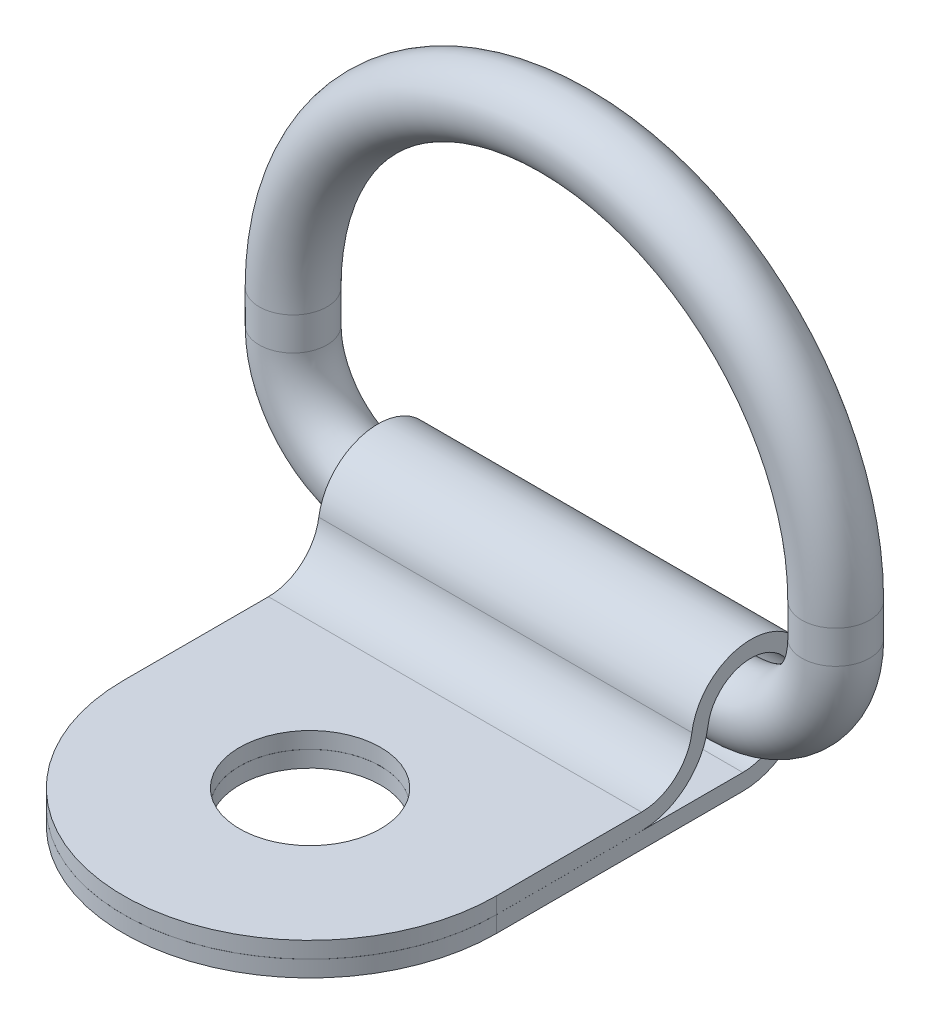
ISO-10303-21;
HEADER;
FILE_DESCRIPTION(('STEP AP214'),'2;1');
FILE_NAME('part.step','',(''),(''),'','','');
FILE_SCHEMA(('AUTOMOTIVE_DESIGN { 1 0 10303 214 1 1 1 1 }'));
ENDSEC;
DATA;
#1=APPLICATION_CONTEXT('core data for automotive mechanical design processes');
#2=APPLICATION_PROTOCOL_DEFINITION('international standard','automotive_design',2000,#1);
#3=PRODUCT_CONTEXT('',#1,'mechanical');
#4=PRODUCT('Part','Part','',(#3));
#5=PRODUCT_RELATED_PRODUCT_CATEGORY('part','',(#4));
#6=PRODUCT_DEFINITION_FORMATION('','',#4);
#7=PRODUCT_DEFINITION_CONTEXT('part definition',#1,'design');
#8=PRODUCT_DEFINITION('design','',#6,#7);
#9=PRODUCT_DEFINITION_SHAPE('','',#8);
#10=(LENGTH_UNIT() NAMED_UNIT(*) SI_UNIT(.MILLI.,.METRE.));
#11=(NAMED_UNIT(*) PLANE_ANGLE_UNIT() SI_UNIT($,.RADIAN.));
#12=(NAMED_UNIT(*) SI_UNIT($,.STERADIAN.) SOLID_ANGLE_UNIT());
#13=UNCERTAINTY_MEASURE_WITH_UNIT(LENGTH_MEASURE(1.E-05),#10,'distance_accuracy_value','');
#14=(GEOMETRIC_REPRESENTATION_CONTEXT(3) GLOBAL_UNCERTAINTY_ASSIGNED_CONTEXT((#13)) GLOBAL_UNIT_ASSIGNED_CONTEXT((#10,
#11,#12)) REPRESENTATION_CONTEXT('',''));
#15=CARTESIAN_POINT('',(0.,0.,0.));
#16=DIRECTION('',(0.,0.,1.));
#17=DIRECTION('',(1.,0.,0.));
#18=AXIS2_PLACEMENT_3D('',#15,#16,#17);
#19=CARTESIAN_POINT('',(8.73125,-3.175,20.6375));
#20=DIRECTION('',(0.,1.,0.));
#21=DIRECTION('',(0.,0.,1.));
#22=AXIS2_PLACEMENT_3D('',#19,#20,#21);
#23=PLANE('',#22);
#24=CARTESIAN_POINT('',(0.,-3.175,11.90625));
#25=DIRECTION('',(0.,-1.,0.));
#26=DIRECTION('',(0.,0.,-1.));
#27=AXIS2_PLACEMENT_3D('',#24,#25,#26);
#28=CIRCLE('',#27,3.302);
#29=CARTESIAN_POINT('',(0.,-3.175,8.60425));
#30=VERTEX_POINT('',#29);
#31=EDGE_CURVE('E264',#30,#30,#28,.T.);
#32=ORIENTED_EDGE('',*,*,#31,.F.);
#33=EDGE_LOOP('',(#32));
#34=FACE_BOUND('',#33,.T.);
#35=CARTESIAN_POINT('',(0.,-3.175,11.90625));
#36=DIRECTION('',(0.,1.,0.));
#37=DIRECTION('',(0.,0.,-1.));
#38=AXIS2_PLACEMENT_3D('',#35,#36,#37);
#39=CIRCLE('',#38,8.73125);
#40=CARTESIAN_POINT('',(-8.73125,-3.175,11.90625));
#41=VERTEX_POINT('',#40);
#42=CARTESIAN_POINT('',(8.73125,-3.175,11.90625));
#43=VERTEX_POINT('',#42);
#44=EDGE_CURVE('E125',#41,#43,#39,.T.);
#45=ORIENTED_EDGE('',*,*,#44,.F.);
#46=DIRECTION('',(0.,0.,-1.));
#47=VECTOR('',#46,1.);
#48=CARTESIAN_POINT('',(-8.73125,-3.175,20.6375));
#49=LINE('',#48,#47);
#50=CARTESIAN_POINT('',(-8.73125,-3.175,0.381));
#51=VERTEX_POINT('',#50);
#52=EDGE_CURVE('E173',#41,#51,#49,.T.);
#53=ORIENTED_EDGE('',*,*,#52,.T.);
#54=DIRECTION('',(-1.,0.,0.));
#55=VECTOR('',#54,1.);
#56=CARTESIAN_POINT('',(8.73125,-3.175,0.381));
#57=LINE('',#56,#55);
#58=CARTESIAN_POINT('',(8.73125,-3.175,0.381));
#59=VERTEX_POINT('',#58);
#60=EDGE_CURVE('E144',#59,#51,#57,.T.);
#61=ORIENTED_EDGE('',*,*,#60,.F.);
#62=DIRECTION('',(0.,0.,-1.));
#63=VECTOR('',#62,1.);
#64=CARTESIAN_POINT('',(8.73125,-3.175,20.6375));
#65=LINE('',#64,#63);
#66=EDGE_CURVE('E137',#43,#59,#65,.T.);
#67=ORIENTED_EDGE('',*,*,#66,.F.);
#68=EDGE_LOOP('',(#45,#53,#61,#67));
#69=FACE_BOUND('',#68,.T.);
#70=ADVANCED_FACE('F39',(#34,#69),#23,.F.);
#71=CARTESIAN_POINT('',(8.73125,0.,0.381));
#72=DIRECTION('',(-1.,0.,0.));
#73=DIRECTION('',(0.,0.,1.));
#74=AXIS2_PLACEMENT_3D('',#71,#72,#73);
#75=CYLINDRICAL_SURFACE('',#74,3.175);
#76=CARTESIAN_POINT('',(-8.73125,0.,0.381));
#77=DIRECTION('',(1.,0.,0.));
#78=DIRECTION('',(0.,0.,-1.));
#79=AXIS2_PLACEMENT_3D('',#76,#77,#78);
#80=CIRCLE('',#79,3.175);
#81=CARTESIAN_POINT('',(-8.73125,0.,-2.794));
#82=VERTEX_POINT('',#81);
#83=EDGE_CURVE('E175',#51,#82,#80,.T.);
#84=ORIENTED_EDGE('',*,*,#83,.T.);
#85=DIRECTION('',(-1.,0.,0.));
#86=VECTOR('',#85,1.);
#87=CARTESIAN_POINT('',(8.73125,0.,-2.794));
#88=LINE('',#87,#86);
#89=CARTESIAN_POINT('',(8.73125,0.,-2.794));
#90=VERTEX_POINT('',#89);
#91=EDGE_CURVE('E208',#90,#82,#88,.T.);
#92=ORIENTED_EDGE('',*,*,#91,.F.);
#93=CARTESIAN_POINT('',(8.73125,0.,0.381));
#94=DIRECTION('',(1.,0.,0.));
#95=DIRECTION('',(0.,0.,-1.));
#96=AXIS2_PLACEMENT_3D('',#93,#94,#95);
#97=CIRCLE('',#96,3.175);
#98=EDGE_CURVE('E146',#59,#90,#97,.T.);
#99=ORIENTED_EDGE('',*,*,#98,.F.);
#100=ORIENTED_EDGE('',*,*,#60,.T.);
#101=EDGE_LOOP('',(#84,#92,#99,#100));
#102=FACE_BOUND('',#101,.T.);
#103=ADVANCED_FACE('F233',(#102),#75,.T.);
#104=CARTESIAN_POINT('',(8.73125,0.,0.));
#105=DIRECTION('',(-1.,0.,0.));
#106=DIRECTION('',(0.,0.,1.));
#107=AXIS2_PLACEMENT_3D('',#104,#105,#106);
#108=CYLINDRICAL_SURFACE('',#107,2.794);
#109=CARTESIAN_POINT('',(-8.73125,0.,0.));
#110=DIRECTION('',(1.,0.,0.));
#111=DIRECTION('',(0.,0.,1.));
#112=AXIS2_PLACEMENT_3D('',#109,#110,#111);
#113=CIRCLE('',#112,2.794);
#114=CARTESIAN_POINT('',(-8.73125,0.395616687116565,2.76584949642509));
#115=VERTEX_POINT('',#114);
#116=EDGE_CURVE('E177',#82,#115,#113,.T.);
#117=ORIENTED_EDGE('',*,*,#116,.T.);
#118=DIRECTION('',(-1.,0.,0.));
#119=VECTOR('',#118,1.);
#120=CARTESIAN_POINT('',(8.73125,0.395616687116565,2.76584949642509));
#121=LINE('',#120,#119);
#122=CARTESIAN_POINT('',(8.73125,0.395616687116565,2.76584949642509));
#123=VERTEX_POINT('',#122);
#124=EDGE_CURVE('E205',#123,#115,#121,.T.);
#125=ORIENTED_EDGE('',*,*,#124,.F.);
#126=CARTESIAN_POINT('',(8.73125,0.,0.));
#127=DIRECTION('',(1.,0.,0.));
#128=DIRECTION('',(0.,0.,1.));
#129=AXIS2_PLACEMENT_3D('',#126,#127,#128);
#130=CIRCLE('',#129,2.794);
#131=EDGE_CURVE('E149',#90,#123,#130,.T.);
#132=ORIENTED_EDGE('',*,*,#131,.F.);
#133=ORIENTED_EDGE('',*,*,#91,.T.);
#134=EDGE_LOOP('',(#117,#125,#132,#133));
#135=FACE_BOUND('',#134,.T.);
#136=ADVANCED_FACE('F229',(#135),#108,.T.);
#137=CARTESIAN_POINT('',(8.73125,0.73279,5.1231075899692));
#138=DIRECTION('',(-1.,0.,0.));
#139=DIRECTION('',(0.,0.,1.));
#140=AXIS2_PLACEMENT_3D('',#137,#138,#139);
#141=CYLINDRICAL_SURFACE('',#140,2.38125);
#142=CARTESIAN_POINT('',(-8.73125,0.73279,5.1231075899692));
#143=DIRECTION('',(-1.,0.,0.));
#144=DIRECTION('',(0.,0.,1.));
#145=AXIS2_PLACEMENT_3D('',#142,#143,#144);
#146=CIRCLE('',#145,2.38125);
#147=CARTESIAN_POINT('',(-8.73125,-1.64846,5.1231075899692));
#148=VERTEX_POINT('',#147);
#149=EDGE_CURVE('E179',#115,#148,#146,.T.);
#150=ORIENTED_EDGE('',*,*,#149,.T.);
#151=DIRECTION('',(-1.,0.,0.));
#152=VECTOR('',#151,1.);
#153=CARTESIAN_POINT('',(8.73125,-1.64846,5.1231075899692));
#154=LINE('',#153,#152);
#155=CARTESIAN_POINT('',(8.73125,-1.64846,5.1231075899692));
#156=VERTEX_POINT('',#155);
#157=EDGE_CURVE('E202',#156,#148,#154,.T.);
#158=ORIENTED_EDGE('',*,*,#157,.F.);
#159=CARTESIAN_POINT('',(8.73125,0.73279,5.1231075899692));
#160=DIRECTION('',(-1.,0.,0.));
#161=DIRECTION('',(0.,0.,1.));
#162=AXIS2_PLACEMENT_3D('',#159,#160,#161);
#163=CIRCLE('',#162,2.38125);
#164=EDGE_CURVE('E158',#123,#156,#163,.T.);
#165=ORIENTED_EDGE('',*,*,#164,.F.);
#166=ORIENTED_EDGE('',*,*,#124,.T.);
#167=EDGE_LOOP('',(#150,#158,#165,#166));
#168=FACE_BOUND('',#167,.T.);
#169=ADVANCED_FACE('F224',(#168),#141,.F.);
#170=CARTESIAN_POINT('',(8.73125,-1.64846,20.6375));
#171=DIRECTION('',(0.,-1.,0.));
#172=DIRECTION('',(0.,0.,-1.));
#173=AXIS2_PLACEMENT_3D('',#170,#171,#172);
#174=PLANE('',#173);
#175=CARTESIAN_POINT('',(0.,-1.64846,11.90625));
#176=DIRECTION('',(0.,-1.,0.));
#177=DIRECTION('',(0.,0.,-1.));
#178=AXIS2_PLACEMENT_3D('',#175,#176,#177);
#179=CIRCLE('',#178,3.302);
#180=CARTESIAN_POINT('',(0.,-1.64846,8.60425));
#181=VERTEX_POINT('',#180);
#182=EDGE_CURVE('E132',#181,#181,#179,.T.);
#183=ORIENTED_EDGE('',*,*,#182,.T.);
#184=EDGE_LOOP('',(#183));
#185=FACE_BOUND('',#184,.T.);
#186=DIRECTION('',(0.,0.,1.));
#187=VECTOR('',#186,1.);
#188=CARTESIAN_POINT('',(-8.73125,-1.64846,20.6375));
#189=LINE('',#188,#187);
#190=CARTESIAN_POINT('',(-8.73125,-1.64846,11.90625));
#191=VERTEX_POINT('',#190);
#192=EDGE_CURVE('E181',#148,#191,#189,.T.);
#193=ORIENTED_EDGE('',*,*,#192,.T.);
#194=CARTESIAN_POINT('',(0.,-1.64846,11.90625));
#195=DIRECTION('',(0.,-1.,0.));
#196=DIRECTION('',(0.,0.,-1.));
#197=AXIS2_PLACEMENT_3D('',#194,#195,#196);
#198=CIRCLE('',#197,8.73125);
#199=CARTESIAN_POINT('',(8.73125,-1.64846,11.90625));
#200=VERTEX_POINT('',#199);
#201=EDGE_CURVE('E54',#191,#200,#198,.F.);
#202=ORIENTED_EDGE('',*,*,#201,.T.);
#203=DIRECTION('',(0.,0.,1.));
#204=VECTOR('',#203,1.);
#205=CARTESIAN_POINT('',(8.73125,-1.64846,20.6375));
#206=LINE('',#205,#204);
#207=EDGE_CURVE('E160',#156,#200,#206,.T.);
#208=ORIENTED_EDGE('',*,*,#207,.F.);
#209=ORIENTED_EDGE('',*,*,#157,.T.);
#210=EDGE_LOOP('',(#193,#202,#208,#209));
#211=FACE_BOUND('',#210,.T.);
#212=ADVANCED_FACE('F219',(#185,#211),#174,.F.);
#213=CARTESIAN_POINT('',(8.73125,-2.41046,20.6375));
#214=DIRECTION('',(0.,1.,0.));
#215=DIRECTION('',(0.,0.,1.));
#216=AXIS2_PLACEMENT_3D('',#213,#214,#215);
#217=PLANE('',#216);
#218=CARTESIAN_POINT('',(0.,-2.41046,11.90625));
#219=DIRECTION('',(0.,1.,0.));
#220=DIRECTION('',(0.,0.,1.));
#221=AXIS2_PLACEMENT_3D('',#218,#219,#220);
#222=CIRCLE('',#221,3.302);
#223=CARTESIAN_POINT('',(0.,-2.41046,15.20825));
#224=VERTEX_POINT('',#223);
#225=EDGE_CURVE('E261',#224,#224,#222,.T.);
#226=ORIENTED_EDGE('',*,*,#225,.T.);
#227=EDGE_LOOP('',(#226));
#228=FACE_BOUND('',#227,.T.);
#229=DIRECTION('',(0.,0.,-1.));
#230=VECTOR('',#229,1.);
#231=CARTESIAN_POINT('',(8.73125,-2.41046,20.6375));
#232=LINE('',#231,#230);
#233=CARTESIAN_POINT('',(8.73125,-2.41046,11.90625));
#234=VERTEX_POINT('',#233);
#235=CARTESIAN_POINT('',(8.73125,-2.41046,5.1231075899692));
#236=VERTEX_POINT('',#235);
#237=EDGE_CURVE('E163',#234,#236,#232,.T.);
#238=ORIENTED_EDGE('',*,*,#237,.F.);
#239=CARTESIAN_POINT('',(0.,-2.41046,11.90625));
#240=DIRECTION('',(0.,1.,0.));
#241=DIRECTION('',(0.,0.,1.));
#242=AXIS2_PLACEMENT_3D('',#239,#240,#241);
#243=CIRCLE('',#242,8.73125);
#244=CARTESIAN_POINT('',(-8.73125,-2.41046,11.90625));
#245=VERTEX_POINT('',#244);
#246=EDGE_CURVE('E239',#234,#245,#243,.F.);
#247=ORIENTED_EDGE('',*,*,#246,.T.);
#248=DIRECTION('',(0.,0.,-1.));
#249=VECTOR('',#248,1.);
#250=CARTESIAN_POINT('',(-8.73125,-2.41046,20.6375));
#251=LINE('',#250,#249);
#252=CARTESIAN_POINT('',(-8.73125,-2.41046,5.1231075899692));
#253=VERTEX_POINT('',#252);
#254=EDGE_CURVE('E184',#245,#253,#251,.T.);
#255=ORIENTED_EDGE('',*,*,#254,.T.);
#256=DIRECTION('',(-1.,0.,0.));
#257=VECTOR('',#256,1.);
#258=CARTESIAN_POINT('',(8.73125,-2.41046,5.1231075899692));
#259=LINE('',#258,#257);
#260=EDGE_CURVE('E199',#236,#253,#259,.T.);
#261=ORIENTED_EDGE('',*,*,#260,.F.);
#262=EDGE_LOOP('',(#238,#247,#255,#261));
#263=FACE_BOUND('',#262,.T.);
#264=ADVANCED_FACE('F238',(#228,#263),#217,.F.);
#265=CARTESIAN_POINT('',(8.73125,0.73279,5.1231075899692));
#266=DIRECTION('',(-1.,0.,0.));
#267=DIRECTION('',(0.,0.,1.));
#268=AXIS2_PLACEMENT_3D('',#265,#266,#267);
#269=CYLINDRICAL_SURFACE('',#268,3.14325);
#270=CARTESIAN_POINT('',(-8.73125,0.73279,5.1231075899692));
#271=DIRECTION('',(1.,0.,0.));
#272=DIRECTION('',(0.,0.,-1.));
#273=AXIS2_PLACEMENT_3D('',#270,#271,#272);
#274=CIRCLE('',#273,3.14325);
#275=CARTESIAN_POINT('',(-8.73125,0.287721226993863,2.01152690649097));
#276=VERTEX_POINT('',#275);
#277=EDGE_CURVE('E186',#253,#276,#274,.T.);
#278=ORIENTED_EDGE('',*,*,#277,.T.);
#279=DIRECTION('',(-1.,0.,0.));
#280=VECTOR('',#279,1.);
#281=CARTESIAN_POINT('',(8.73125,0.287721226993863,2.01152690649097));
#282=LINE('',#281,#280);
#283=CARTESIAN_POINT('',(8.73125,0.287721226993863,2.01152690649097));
#284=VERTEX_POINT('',#283);
#285=EDGE_CURVE('E196',#284,#276,#282,.T.);
#286=ORIENTED_EDGE('',*,*,#285,.F.);
#287=CARTESIAN_POINT('',(8.73125,0.73279,5.1231075899692));
#288=DIRECTION('',(1.,0.,0.));
#289=DIRECTION('',(0.,0.,-1.));
#290=AXIS2_PLACEMENT_3D('',#287,#288,#289);
#291=CIRCLE('',#290,3.14325);
#292=EDGE_CURVE('E165',#236,#284,#291,.T.);
#293=ORIENTED_EDGE('',*,*,#292,.F.);
#294=ORIENTED_EDGE('',*,*,#260,.T.);
#295=EDGE_LOOP('',(#278,#286,#293,#294));
#296=FACE_BOUND('',#295,.T.);
#297=ADVANCED_FACE('F243',(#296),#269,.T.);
#298=CARTESIAN_POINT('',(8.73125,0.,0.));
#299=DIRECTION('',(-1.,0.,0.));
#300=DIRECTION('',(0.,0.,1.));
#301=AXIS2_PLACEMENT_3D('',#298,#299,#300);
#302=CYLINDRICAL_SURFACE('',#301,2.032);
#303=CARTESIAN_POINT('',(-8.73125,0.,0.));
#304=DIRECTION('',(-1.,0.,0.));
#305=DIRECTION('',(0.,0.,1.));
#306=AXIS2_PLACEMENT_3D('',#303,#304,#305);
#307=CIRCLE('',#306,2.032);
#308=CARTESIAN_POINT('',(-8.73125,0.,-2.032));
#309=VERTEX_POINT('',#308);
#310=EDGE_CURVE('E188',#276,#309,#307,.T.);
#311=ORIENTED_EDGE('',*,*,#310,.T.);
#312=DIRECTION('',(-1.,0.,0.));
#313=VECTOR('',#312,1.);
#314=CARTESIAN_POINT('',(8.73125,0.,-2.032));
#315=LINE('',#314,#313);
#316=CARTESIAN_POINT('',(8.73125,0.,-2.032));
#317=VERTEX_POINT('',#316);
#318=EDGE_CURVE('E193',#317,#309,#315,.T.);
#319=ORIENTED_EDGE('',*,*,#318,.F.);
#320=CARTESIAN_POINT('',(8.73125,0.,0.));
#321=DIRECTION('',(-1.,0.,0.));
#322=DIRECTION('',(0.,0.,1.));
#323=AXIS2_PLACEMENT_3D('',#320,#321,#322);
#324=CIRCLE('',#323,2.032);
#325=EDGE_CURVE('E167',#284,#317,#324,.T.);
#326=ORIENTED_EDGE('',*,*,#325,.F.);
#327=ORIENTED_EDGE('',*,*,#285,.T.);
#328=EDGE_LOOP('',(#311,#319,#326,#327));
#329=FACE_BOUND('',#328,.T.);
#330=ADVANCED_FACE('F249',(#329),#302,.F.);
#331=CARTESIAN_POINT('',(8.73125,0.,0.381));
#332=DIRECTION('',(-1.,0.,0.));
#333=DIRECTION('',(0.,0.,1.));
#334=AXIS2_PLACEMENT_3D('',#331,#332,#333);
#335=CYLINDRICAL_SURFACE('',#334,2.413);
#336=CARTESIAN_POINT('',(-8.73125,0.,0.381));
#337=DIRECTION('',(-1.,0.,0.));
#338=DIRECTION('',(0.,0.,-1.));
#339=AXIS2_PLACEMENT_3D('',#336,#337,#338);
#340=CIRCLE('',#339,2.413);
#341=CARTESIAN_POINT('',(-8.73125,-2.413,0.381));
#342=VERTEX_POINT('',#341);
#343=EDGE_CURVE('E152',#309,#342,#340,.T.);
#344=ORIENTED_EDGE('',*,*,#343,.T.);
#345=DIRECTION('',(-1.,0.,0.));
#346=VECTOR('',#345,1.);
#347=CARTESIAN_POINT('',(8.73125,-2.413,0.381));
#348=LINE('',#347,#346);
#349=CARTESIAN_POINT('',(8.73125,-2.413,0.381));
#350=VERTEX_POINT('',#349);
#351=EDGE_CURVE('E172',#350,#342,#348,.T.);
#352=ORIENTED_EDGE('',*,*,#351,.F.);
#353=CARTESIAN_POINT('',(8.73125,0.,0.381));
#354=DIRECTION('',(-1.,0.,0.));
#355=DIRECTION('',(0.,0.,-1.));
#356=AXIS2_PLACEMENT_3D('',#353,#354,#355);
#357=CIRCLE('',#356,2.413);
#358=EDGE_CURVE('E169',#317,#350,#357,.T.);
#359=ORIENTED_EDGE('',*,*,#358,.F.);
#360=ORIENTED_EDGE('',*,*,#318,.T.);
#361=EDGE_LOOP('',(#344,#352,#359,#360));
#362=FACE_BOUND('',#361,.T.);
#363=ADVANCED_FACE('F253',(#362),#335,.F.);
#364=CARTESIAN_POINT('',(8.73125,-2.413,20.6375));
#365=DIRECTION('',(0.,-1.,0.));
#366=DIRECTION('',(0.,0.,-1.));
#367=AXIS2_PLACEMENT_3D('',#364,#365,#366);
#368=PLANE('',#367);
#369=CARTESIAN_POINT('',(0.,-2.413,11.90625));
#370=DIRECTION('',(0.,-1.,0.));
#371=DIRECTION('',(0.,0.,-1.));
#372=AXIS2_PLACEMENT_3D('',#369,#370,#371);
#373=CIRCLE('',#372,3.302);
#374=CARTESIAN_POINT('',(0.,-2.413,8.60425));
#375=VERTEX_POINT('',#374);
#376=EDGE_CURVE('E42',#375,#375,#373,.T.);
#377=ORIENTED_EDGE('',*,*,#376,.T.);
#378=EDGE_LOOP('',(#377));
#379=FACE_BOUND('',#378,.T.);
#380=DIRECTION('',(0.,0.,1.));
#381=VECTOR('',#380,1.);
#382=CARTESIAN_POINT('',(-8.73125,-2.413,20.6375));
#383=LINE('',#382,#381);
#384=CARTESIAN_POINT('',(-8.73125,-2.413,11.90625));
#385=VERTEX_POINT('',#384);
#386=EDGE_CURVE('E147',#342,#385,#383,.T.);
#387=ORIENTED_EDGE('',*,*,#386,.T.);
#388=CARTESIAN_POINT('',(0.,-2.413,11.90625));
#389=DIRECTION('',(0.,-1.,0.));
#390=DIRECTION('',(0.,0.,-1.));
#391=AXIS2_PLACEMENT_3D('',#388,#389,#390);
#392=CIRCLE('',#391,8.73125);
#393=CARTESIAN_POINT('',(8.73125,-2.413,11.90625));
#394=VERTEX_POINT('',#393);
#395=EDGE_CURVE('E62',#385,#394,#392,.F.);
#396=ORIENTED_EDGE('',*,*,#395,.T.);
#397=DIRECTION('',(0.,0.,1.));
#398=VECTOR('',#397,1.);
#399=CARTESIAN_POINT('',(8.73125,-2.413,20.6375));
#400=LINE('',#399,#398);
#401=EDGE_CURVE('E140',#350,#394,#400,.T.);
#402=ORIENTED_EDGE('',*,*,#401,.F.);
#403=ORIENTED_EDGE('',*,*,#351,.T.);
#404=EDGE_LOOP('',(#387,#396,#402,#403));
#405=FACE_BOUND('',#404,.T.);
#406=ADVANCED_FACE('F256',(#379,#405),#368,.F.);
#407=CARTESIAN_POINT('',(8.73125,0.,0.381));
#408=DIRECTION('',(1.,0.,0.));
#409=DIRECTION('',(0.,0.,-1.));
#410=AXIS2_PLACEMENT_3D('',#407,#408,#409);
#411=PLANE('',#410);
#412=DIRECTION('',(0.,-1.,0.));
#413=VECTOR('',#412,1.);
#414=CARTESIAN_POINT('',(8.73125,20.6375,11.90625));
#415=LINE('',#414,#413);
#416=EDGE_CURVE('E128',#394,#43,#415,.T.);
#417=ORIENTED_EDGE('',*,*,#416,.T.);
#418=ORIENTED_EDGE('',*,*,#66,.T.);
#419=ORIENTED_EDGE('',*,*,#98,.T.);
#420=ORIENTED_EDGE('',*,*,#131,.T.);
#421=ORIENTED_EDGE('',*,*,#164,.T.);
#422=ORIENTED_EDGE('',*,*,#207,.T.);
#423=EDGE_CURVE('E141',#200,#234,#415,.T.);
#424=ORIENTED_EDGE('',*,*,#423,.T.);
#425=ORIENTED_EDGE('',*,*,#237,.T.);
#426=ORIENTED_EDGE('',*,*,#292,.T.);
#427=ORIENTED_EDGE('',*,*,#325,.T.);
#428=ORIENTED_EDGE('',*,*,#358,.T.);
#429=ORIENTED_EDGE('',*,*,#401,.T.);
#430=EDGE_LOOP('',(#417,#418,#419,#420,#421,#422,#424,#425,#426,#427,#428,#429));
#431=FACE_BOUND('',#430,.T.);
#432=ADVANCED_FACE('F136',(#431),#411,.T.);
#433=CARTESIAN_POINT('',(-8.73125,0.,0.381));
#434=DIRECTION('',(1.,0.,0.));
#435=DIRECTION('',(0.,0.,-1.));
#436=AXIS2_PLACEMENT_3D('',#433,#434,#435);
#437=PLANE('',#436);
#438=ORIENTED_EDGE('',*,*,#52,.F.);
#439=DIRECTION('',(0.,-1.,0.));
#440=VECTOR('',#439,1.);
#441=CARTESIAN_POINT('',(-8.73125,20.6375,11.90625));
#442=LINE('',#441,#440);
#443=EDGE_CURVE('E12',#41,#385,#442,.F.);
#444=ORIENTED_EDGE('',*,*,#443,.T.);
#445=ORIENTED_EDGE('',*,*,#386,.F.);
#446=ORIENTED_EDGE('',*,*,#343,.F.);
#447=ORIENTED_EDGE('',*,*,#310,.F.);
#448=ORIENTED_EDGE('',*,*,#277,.F.);
#449=ORIENTED_EDGE('',*,*,#254,.F.);
#450=EDGE_CURVE('E47',#245,#191,#442,.F.);
#451=ORIENTED_EDGE('',*,*,#450,.T.);
#452=ORIENTED_EDGE('',*,*,#192,.F.);
#453=ORIENTED_EDGE('',*,*,#149,.F.);
#454=ORIENTED_EDGE('',*,*,#116,.F.);
#455=ORIENTED_EDGE('',*,*,#83,.F.);
#456=EDGE_LOOP('',(#438,#444,#445,#446,#447,#448,#449,#451,#452,#453,#454,#455));
#457=FACE_BOUND('',#456,.T.);
#458=ADVANCED_FACE('F214',(#457),#437,.F.);
#459=CARTESIAN_POINT('',(0.,20.6375,11.90625));
#460=DIRECTION('',(0.,-1.,0.));
#461=DIRECTION('',(0.,0.,-1.));
#462=AXIS2_PLACEMENT_3D('',#459,#460,#461);
#463=CYLINDRICAL_SURFACE('',#462,8.73125);
#464=ORIENTED_EDGE('',*,*,#450,.F.);
#465=ORIENTED_EDGE('',*,*,#246,.F.);
#466=ORIENTED_EDGE('',*,*,#423,.F.);
#467=ORIENTED_EDGE('',*,*,#201,.F.);
#468=EDGE_LOOP('',(#464,#465,#466,#467));
#469=FACE_BOUND('',#468,.T.);
#470=ADVANCED_FACE('F281',(#469),#463,.T.);
#471=ORIENTED_EDGE('',*,*,#44,.T.);
#472=ORIENTED_EDGE('',*,*,#416,.F.);
#473=ORIENTED_EDGE('',*,*,#395,.F.);
#474=ORIENTED_EDGE('',*,*,#443,.F.);
#475=EDGE_LOOP('',(#471,#472,#473,#474));
#476=FACE_BOUND('',#475,.T.);
#477=ADVANCED_FACE('F127',(#476),#463,.T.);
#478=CARTESIAN_POINT('',(0.,20.6375,11.90625));
#479=DIRECTION('',(0.,-1.,0.));
#480=DIRECTION('',(0.,0.,-1.));
#481=AXIS2_PLACEMENT_3D('',#478,#479,#480);
#482=CYLINDRICAL_SURFACE('',#481,3.302);
#483=ORIENTED_EDGE('',*,*,#31,.T.);
#484=EDGE_LOOP('',(#483));
#485=FACE_BOUND('',#484,.T.);
#486=ORIENTED_EDGE('',*,*,#376,.F.);
#487=EDGE_LOOP('',(#486));
#488=FACE_BOUND('',#487,.T.);
#489=ADVANCED_FACE('F272',(#485,#488),#482,.F.);
#490=ORIENTED_EDGE('',*,*,#225,.F.);
#491=EDGE_LOOP('',(#490));
#492=FACE_BOUND('',#491,.T.);
#493=ORIENTED_EDGE('',*,*,#182,.F.);
#494=EDGE_LOOP('',(#493));
#495=FACE_BOUND('',#494,.T.);
#496=ADVANCED_FACE('F274',(#492,#495),#482,.F.);
#497=CLOSED_SHELL('',(#70,#103,#136,#169,#212,#264,#297,#330,#363,#406,#432,#458,#470,#477,#489,#496));
#498=MANIFOLD_SOLID_BREP('B2',#497);
#499=CARTESIAN_POINT('',(7.89409875810043,4.80590124189957,0.));
#500=DIRECTION('',(0.,0.,-1.));
#501=DIRECTION('',(-1.,0.,0.));
#502=AXIS2_PLACEMENT_3D('',#499,#500,#501);
#503=TOROIDAL_SURFACE('',#502,4.80590124189957,1.5875);
#504=CARTESIAN_POINT('',(12.7,4.80590124189957,0.));
#505=DIRECTION('',(0.,1.,0.));
#506=DIRECTION('',(0.,0.,-1.));
#507=AXIS2_PLACEMENT_3D('',#504,#505,#506);
#508=CIRCLE('',#507,1.5875);
#509=CARTESIAN_POINT('',(14.2875,4.80590124189958,0.));
#510=VERTEX_POINT('',#509);
#511=EDGE_CURVE('E415',#510,#510,#508,.T.);
#512=CARTESIAN_POINT('',(7.89409875810044,0.,0.));
#513=DIRECTION('',(1.,0.,0.));
#514=DIRECTION('',(0.,0.,-1.));
#515=AXIS2_PLACEMENT_3D('',#512,#513,#514);
#516=CIRCLE('',#515,1.5875);
#517=CARTESIAN_POINT('',(7.89409875810044,-1.5875,0.));
#518=VERTEX_POINT('',#517);
#519=EDGE_CURVE('E38',#518,#518,#516,.T.);
#520=CARTESIAN_POINT('',(7.89409875810043,4.80590124189957,0.));
#521=DIRECTION('',(0.,0.,-1.));
#522=DIRECTION('',(-1.,0.,0.));
#523=AXIS2_PLACEMENT_3D('',#520,#521,#522);
#524=CIRCLE('',#523,6.39340124189957);
#525=EDGE_CURVE('',#510,#518,#524,.T.);
#526=ORIENTED_EDGE('',*,*,#511,.F.);
#527=ORIENTED_EDGE('',*,*,#519,.T.);
#528=ORIENTED_EDGE('',*,*,#525,.T.);
#529=ORIENTED_EDGE('',*,*,#525,.F.);
#530=EDGE_LOOP('',(#526,#528,#527,#529));
#531=FACE_BOUND('',#530,.T.);
#532=ADVANCED_FACE('F409',(#531),#503,.T.);
#533=CARTESIAN_POINT('',(12.7,6.35,0.));
#534=DIRECTION('',(0.,-1.,0.));
#535=DIRECTION('',(1.,0.,0.));
#536=AXIS2_PLACEMENT_3D('',#533,#534,#535);
#537=CYLINDRICAL_SURFACE('',#536,1.5875);
#538=CARTESIAN_POINT('',(12.7,6.35,0.));
#539=DIRECTION('',(0.,1.,0.));
#540=DIRECTION('',(0.,0.,-1.));
#541=AXIS2_PLACEMENT_3D('',#538,#539,#540);
#542=CIRCLE('',#541,1.5875);
#543=CARTESIAN_POINT('',(14.2875,6.35,0.));
#544=VERTEX_POINT('',#543);
#545=EDGE_CURVE('E419',#544,#544,#542,.T.);
#546=ORIENTED_EDGE('',*,*,#545,.F.);
#547=EDGE_LOOP('',(#546));
#548=FACE_BOUND('',#547,.T.);
#549=ORIENTED_EDGE('',*,*,#511,.T.);
#550=EDGE_LOOP('',(#549));
#551=FACE_BOUND('',#550,.T.);
#552=ADVANCED_FACE('F453',(#548,#551),#537,.T.);
#553=CARTESIAN_POINT('',(0.,6.35,0.));
#554=DIRECTION('',(0.,0.,-1.));
#555=DIRECTION('',(-1.,0.,0.));
#556=AXIS2_PLACEMENT_3D('',#553,#554,#555);
#557=TOROIDAL_SURFACE('',#556,12.7,1.5875);
#558=CARTESIAN_POINT('',(-12.7,6.34999999999999,0.));
#559=DIRECTION('',(0.,-1.,0.));
#560=DIRECTION('',(0.,0.,-1.));
#561=AXIS2_PLACEMENT_3D('',#558,#559,#560);
#562=CIRCLE('',#561,1.5875);
#563=CARTESIAN_POINT('',(-14.2875,6.34999999999999,0.));
#564=VERTEX_POINT('',#563);
#565=EDGE_CURVE('E423',#564,#564,#562,.T.);
#566=CARTESIAN_POINT('',(0.,6.35,0.));
#567=DIRECTION('',(0.,0.,-1.));
#568=DIRECTION('',(-1.,0.,0.));
#569=AXIS2_PLACEMENT_3D('',#566,#567,#568);
#570=CIRCLE('',#569,14.2875);
#571=EDGE_CURVE('',#564,#544,#570,.T.);
#572=ORIENTED_EDGE('',*,*,#565,.F.);
#573=ORIENTED_EDGE('',*,*,#545,.T.);
#574=ORIENTED_EDGE('',*,*,#571,.T.);
#575=ORIENTED_EDGE('',*,*,#571,.F.);
#576=EDGE_LOOP('',(#572,#574,#573,#575));
#577=FACE_BOUND('',#576,.T.);
#578=ADVANCED_FACE('F447',(#577),#557,.T.);
#579=CARTESIAN_POINT('',(-12.7,4.80590124189956,0.));
#580=DIRECTION('',(0.,1.,0.));
#581=DIRECTION('',(-1.,0.,0.));
#582=AXIS2_PLACEMENT_3D('',#579,#580,#581);
#583=CYLINDRICAL_SURFACE('',#582,1.5875);
#584=CARTESIAN_POINT('',(-12.7,4.80590124189956,0.));
#585=DIRECTION('',(0.,-1.,0.));
#586=DIRECTION('',(0.,0.,-1.));
#587=AXIS2_PLACEMENT_3D('',#584,#585,#586);
#588=CIRCLE('',#587,1.5875);
#589=CARTESIAN_POINT('',(-14.2875,4.80590124189956,0.));
#590=VERTEX_POINT('',#589);
#591=EDGE_CURVE('E428',#590,#590,#588,.T.);
#592=ORIENTED_EDGE('',*,*,#591,.F.);
#593=EDGE_LOOP('',(#592));
#594=FACE_BOUND('',#593,.T.);
#595=ORIENTED_EDGE('',*,*,#565,.T.);
#596=EDGE_LOOP('',(#595));
#597=FACE_BOUND('',#596,.T.);
#598=ADVANCED_FACE('F441',(#594,#597),#583,.T.);
#599=CARTESIAN_POINT('',(-7.89409875810043,4.80590124189957,0.));
#600=DIRECTION('',(0.,0.,-1.));
#601=DIRECTION('',(-1.,0.,0.));
#602=AXIS2_PLACEMENT_3D('',#599,#600,#601);
#603=TOROIDAL_SURFACE('',#602,4.80590124189957,1.5875);
#604=CARTESIAN_POINT('',(-7.89409875810043,0.,0.));
#605=DIRECTION('',(1.,0.,0.));
#606=DIRECTION('',(0.,0.,-1.));
#607=AXIS2_PLACEMENT_3D('',#604,#605,#606);
#608=CIRCLE('',#607,1.5875);
#609=CARTESIAN_POINT('',(-7.89409875810043,-1.5875,0.));
#610=VERTEX_POINT('',#609);
#611=EDGE_CURVE('E431',#610,#610,#608,.T.);
#612=CARTESIAN_POINT('',(-7.89409875810043,4.80590124189957,0.));
#613=DIRECTION('',(0.,0.,-1.));
#614=DIRECTION('',(-1.,0.,0.));
#615=AXIS2_PLACEMENT_3D('',#612,#613,#614);
#616=CIRCLE('',#615,6.39340124189957);
#617=EDGE_CURVE('',#610,#590,#616,.T.);
#618=ORIENTED_EDGE('',*,*,#611,.F.);
#619=ORIENTED_EDGE('',*,*,#591,.T.);
#620=ORIENTED_EDGE('',*,*,#617,.T.);
#621=ORIENTED_EDGE('',*,*,#617,.F.);
#622=EDGE_LOOP('',(#618,#620,#619,#621));
#623=FACE_BOUND('',#622,.T.);
#624=ADVANCED_FACE('F438',(#623),#603,.T.);
#625=CARTESIAN_POINT('',(-7.89409875810043,0.,0.));
#626=DIRECTION('',(1.,0.,0.));
#627=DIRECTION('',(0.,0.,-1.));
#628=AXIS2_PLACEMENT_3D('',#625,#626,#627);
#629=CYLINDRICAL_SURFACE('',#628,1.5875);
#630=ORIENTED_EDGE('',*,*,#611,.T.);
#631=EDGE_LOOP('',(#630));
#632=FACE_BOUND('',#631,.T.);
#633=ORIENTED_EDGE('',*,*,#519,.F.);
#634=EDGE_LOOP('',(#633));
#635=FACE_BOUND('',#634,.T.);
#636=ADVANCED_FACE('F435',(#632,#635),#629,.T.);
#637=CLOSED_SHELL('',(#532,#552,#578,#598,#624,#636));
#638=MANIFOLD_SOLID_BREP('B6',#637);
#639=ADVANCED_BREP_SHAPE_REPRESENTATION('',(#18,#498,#638),#14);
#640=SHAPE_DEFINITION_REPRESENTATION(#9,#639);
ENDSEC;
END-ISO-10303-21;
